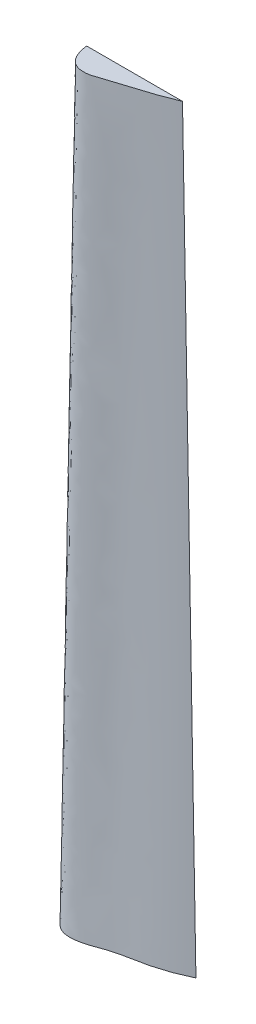
ISO-10303-21;
HEADER;
FILE_DESCRIPTION(('STEP AP214'),'2;1');
FILE_NAME('part.step','',(''),(''),'','','');
FILE_SCHEMA(('AUTOMOTIVE_DESIGN { 1 0 10303 214 1 1 1 1 }'));
ENDSEC;
DATA;
#1=APPLICATION_CONTEXT('core data for automotive mechanical design processes');
#2=APPLICATION_PROTOCOL_DEFINITION('international standard','automotive_design',2000,#1);
#3=PRODUCT_CONTEXT('',#1,'mechanical');
#4=PRODUCT('Part','Part','',(#3));
#5=PRODUCT_RELATED_PRODUCT_CATEGORY('part','',(#4));
#6=PRODUCT_DEFINITION_FORMATION('','',#4);
#7=PRODUCT_DEFINITION_CONTEXT('part definition',#1,'design');
#8=PRODUCT_DEFINITION('design','',#6,#7);
#9=PRODUCT_DEFINITION_SHAPE('','',#8);
#10=(LENGTH_UNIT() NAMED_UNIT(*) SI_UNIT(.MILLI.,.METRE.));
#11=(NAMED_UNIT(*) PLANE_ANGLE_UNIT() SI_UNIT($,.RADIAN.));
#12=(NAMED_UNIT(*) SI_UNIT($,.STERADIAN.) SOLID_ANGLE_UNIT());
#13=UNCERTAINTY_MEASURE_WITH_UNIT(LENGTH_MEASURE(1.E-05),#10,'distance_accuracy_value','');
#14=(GEOMETRIC_REPRESENTATION_CONTEXT(3) GLOBAL_UNCERTAINTY_ASSIGNED_CONTEXT((#13)) GLOBAL_UNIT_ASSIGNED_CONTEXT((#10,
#11,#12)) REPRESENTATION_CONTEXT('',''));
#15=CARTESIAN_POINT('',(0.,0.,0.));
#16=DIRECTION('',(0.,0.,1.));
#17=DIRECTION('',(1.,0.,0.));
#18=AXIS2_PLACEMENT_3D('',#15,#16,#17);
#19=CARTESIAN_POINT('',(0.,220.,0.));
#20=DIRECTION('',(0.,1.,0.));
#21=DIRECTION('',(0.,0.,1.));
#22=AXIS2_PLACEMENT_3D('',#19,#20,#21);
#23=PLANE('',#22);
#24=CARTESIAN_POINT('',(17.9356753736188,220.,0.));
#25=CARTESIAN_POINT('',(17.6745843947414,220.,0.124258185580106));
#26=CARTESIAN_POINT('',(17.4129871207745,220.,0.247471349846727));
#27=CARTESIAN_POINT('',(16.8883284609712,220.,0.491215000488047));
#28=CARTESIAN_POINT('',(16.6252661921638,220.,0.611743584182137));
#29=CARTESIAN_POINT('',(16.0974838686661,220.,0.849397931931943));
#30=CARTESIAN_POINT('',(15.8327632210935,220.,0.966522383331062));
#31=CARTESIAN_POINT('',(15.3014626985356,220.,1.19661419549458));
#32=CARTESIAN_POINT('',(15.0348825076295,220.,1.30958082835811));
#33=CARTESIAN_POINT('',(14.4997402421582,220.,1.53077405437101));
#34=CARTESIAN_POINT('',(14.2311780396367,220.,1.63900033830509));
#35=CARTESIAN_POINT('',(13.6947930858415,220.,1.84954388962534));
#36=CARTESIAN_POINT('',(13.4269890288549,220.,1.95190879503392));
#37=CARTESIAN_POINT('',(12.8896417448132,220.,2.15186733967646));
#38=CARTESIAN_POINT('',(12.6200987280809,220.,2.24946154410745));
#39=CARTESIAN_POINT('',(12.0793505091102,220.,2.439803263402));
#40=CARTESIAN_POINT('',(11.8081455543879,220.,2.53255148128734));
#41=CARTESIAN_POINT('',(11.2641293030185,220.,2.71306606708702));
#42=CARTESIAN_POINT('',(10.9913182698034,220.,2.80083322818558));
#43=CARTESIAN_POINT('',(10.4441105699269,220.,2.97113730157665));
#44=CARTESIAN_POINT('',(10.1697141331291,220.,3.05367495229908));
#45=CARTESIAN_POINT('',(9.54915223631109,220.,3.23375440322171));
#46=CARTESIAN_POINT('',(9.20253733056889,220.,3.32975166423543));
#47=CARTESIAN_POINT('',(8.50708583236111,220.,3.51346171073488));
#48=CARTESIAN_POINT('',(8.15824900427751,220.,3.60117360146547));
#49=CARTESIAN_POINT('',(7.45875033282788,220.,3.76920610694126));
#50=CARTESIAN_POINT('',(7.10808821546304,220.,3.84952557608203));
#51=CARTESIAN_POINT('',(6.40541884334964,220.,4.00400123260278));
#52=CARTESIAN_POINT('',(6.05341158520402,220.,4.07815740440704));
#53=CARTESIAN_POINT('',(5.34883336884934,220.,4.22239726981944));
#54=CARTESIAN_POINT('',(4.99626299021932,220.,4.2924838246069));
#55=CARTESIAN_POINT('',(4.29074670369543,220.,4.43047062291408));
#56=CARTESIAN_POINT('',(3.93780085137768,220.,4.49837115317218));
#57=CARTESIAN_POINT('',(3.40837967949286,220.,4.60016618341384));
#58=CARTESIAN_POINT('',(3.23190954639736,220.,4.63408779968064));
#59=CARTESIAN_POINT('',(2.87903393025213,220.,4.70226506728379));
#60=CARTESIAN_POINT('',(2.70262844739229,220.,4.73652071959319));
#61=CARTESIAN_POINT('',(2.17361988955152,220.,4.84048198116401));
#62=CARTESIAN_POINT('',(1.82124418456845,220.,4.91137824861031));
#63=CARTESIAN_POINT('',(1.29423383065323,220.,5.02267758985397));
#64=CARTESIAN_POINT('',(1.11906650402693,220.,5.06054678051437));
#65=CARTESIAN_POINT('',(0.769189700266165,220.,5.13835946490068));
#66=CARTESIAN_POINT('',(0.59448022925804,220.,5.17830298623486));
#67=CARTESIAN_POINT('',(0.245579648827286,220.,5.26034850178093));
#68=CARTESIAN_POINT('',(0.0713885095947851,220.,5.30245036922217));
#69=CARTESIAN_POINT('',(-0.276377929542773,220.,5.38908540452656));
#70=CARTESIAN_POINT('',(-0.449953275587467,220.,5.43361838595298));
#71=CARTESIAN_POINT('',(-0.710239606834221,220.,5.50290480090183));
#72=CARTESIAN_POINT('',(-0.797261024324483,220.,5.52649248627727));
#73=CARTESIAN_POINT('',(-0.971058848225949,220.,5.57455363384174));
#74=CARTESIAN_POINT('',(-1.05783525468675,220.,5.59902709585144));
#75=CARTESIAN_POINT('',(-1.31778253975794,220.,5.67377990997176));
#76=CARTESIAN_POINT('',(-1.49057219973852,220.,5.72539188019096));
#77=CARTESIAN_POINT('',(-1.83507092039475,220.,5.8320398875767));
#78=CARTESIAN_POINT('',(-2.00678007871897,220.,5.88707561028765));
#79=CARTESIAN_POINT('',(-2.34912014719449,220.,6.00026313280188));
#80=CARTESIAN_POINT('',(-2.51975131692072,220.,6.05841414778679));
#81=CARTESIAN_POINT('',(-2.92000003637014,220.,6.19853250248257));
#82=CARTESIAN_POINT('',(-3.14920556750189,220.,6.28166870505999));
#83=CARTESIAN_POINT('',(-3.60703584978255,220.,6.44954062992792));
#84=CARTESIAN_POINT('',(-3.8356605581591,220.,6.53427646635271));
#85=CARTESIAN_POINT('',(-4.17906181714093,220.,6.66017686500914));
#86=CARTESIAN_POINT('',(-4.2936144041778,220.,6.70194602270268));
#87=CARTESIAN_POINT('',(-4.52298691525059,220.,6.78474187233336));
#88=CARTESIAN_POINT('',(-4.63780683782775,220.,6.82576856831118));
#89=CARTESIAN_POINT('',(-4.98279093361294,220.,6.94735471042534));
#90=CARTESIAN_POINT('',(-5.21348456772825,220.,7.02642212028772));
#91=CARTESIAN_POINT('',(-5.56091928610701,220.,7.14201403112369));
#92=CARTESIAN_POINT('',(-5.67714356026004,220.,7.18009953490928));
#93=CARTESIAN_POINT('',(-5.9099583229908,220.,7.25513383828361));
#94=CARTESIAN_POINT('',(-6.02654881097034,220.,7.292082639728));
#95=CARTESIAN_POINT('',(-6.37697342347263,220.,7.40084732382348));
#96=CARTESIAN_POINT('',(-6.61146137715159,220.,7.47058171535971));
#97=CARTESIAN_POINT('',(-7.07824984969774,220.,7.60158797938875));
#98=CARTESIAN_POINT('',(-7.31051355717142,220.,7.66298978387524));
#99=CARTESIAN_POINT('',(-7.66041557721527,220.,7.74895043117744));
#100=CARTESIAN_POINT('',(-7.77730287956583,220.,7.77658076699452));
#101=CARTESIAN_POINT('',(-8.01158034535783,220.,7.82961712936871));
#102=CARTESIAN_POINT('',(-8.1289705092009,220.,7.85502315414894));
#103=CARTESIAN_POINT('',(-8.48152302189106,220.,7.92744116610383));
#104=CARTESIAN_POINT('',(-8.7174661320411,220.,7.97075266489475));
#105=CARTESIAN_POINT('',(-9.19131331770284,220.,8.0452395096841));
#106=CARTESIAN_POINT('',(-9.42921757515879,220.,8.07641371641311));
#107=CARTESIAN_POINT('',(-9.90543968448188,220.,8.12432081291977));
#108=CARTESIAN_POINT('',(-10.143750849884,220.,8.14111810017481));
#109=CARTESIAN_POINT('',(-10.6209156871192,220.,8.15812493542641));
#110=CARTESIAN_POINT('',(-10.8597690897629,220.,8.15834143165338));
#111=CARTESIAN_POINT('',(-11.3191093460747,220.,8.14037867486133));
#112=CARTESIAN_POINT('',(-11.5396434120626,220.,8.12356377995662));
#113=CARTESIAN_POINT('',(-11.8687802990093,220.,8.08448490414536));
#114=CARTESIAN_POINT('',(-11.9782255050494,220.,8.06914708246528));
#115=CARTESIAN_POINT('',(-12.1963760255786,220.,8.03357712619998));
#116=CARTESIAN_POINT('',(-12.3050809156567,220.,8.01334239324527));
#117=CARTESIAN_POINT('',(-12.6295108576939,220.,7.94493313478044));
#118=CARTESIAN_POINT('',(-12.8436781348994,220.,7.8890391504018));
#119=CARTESIAN_POINT('',(-13.2649535021318,220.,7.7552148870856));
#120=CARTESIAN_POINT('',(-13.472065444909,220.,7.67729685832708));
#121=CARTESIAN_POINT('',(-13.8213986570227,220.,7.52293763716322));
#122=CARTESIAN_POINT('',(-13.9659863264342,220.,7.45182587998018));
#123=CARTESIAN_POINT('',(-14.2484574770991,220.,7.29736241246307));
#124=CARTESIAN_POINT('',(-14.3863425784512,220.,7.21401367974613));
#125=CARTESIAN_POINT('',(-14.6540638974358,220.,7.03557993325182));
#126=CARTESIAN_POINT('',(-14.7839090340396,220.,6.9405082875888));
#127=CARTESIAN_POINT('',(-15.0348130462058,220.,6.73937452706912));
#128=CARTESIAN_POINT('',(-15.1558714735178,220.,6.63331185217855));
#129=CARTESIAN_POINT('',(-15.3300758952929,220.,6.46723516079898));
#130=CARTESIAN_POINT('',(-15.3867618884535,220.,6.41088344114673));
#131=CARTESIAN_POINT('',(-15.4977945330678,220.,6.29591961543113));
#132=CARTESIAN_POINT('',(-15.5521411862926,220.,6.23730751107919));
#133=CARTESIAN_POINT('',(-15.7117161858106,220.,6.05839981070726));
#134=CARTESIAN_POINT('',(-15.8135001683831,220.,5.9350130407964));
#135=CARTESIAN_POINT('',(-16.0084950869388,220.,5.68133070679519));
#136=CARTESIAN_POINT('',(-16.1016894956868,220.,5.55102255417763));
#137=CARTESIAN_POINT('',(-16.2798476404402,220.,5.28487862902487));
#138=CARTESIAN_POINT('',(-16.3648098629052,220.,5.1490418465102));
#139=CARTESIAN_POINT('',(-16.5182700574874,220.,4.88772666410068));
#140=CARTESIAN_POINT('',(-16.5875557573159,220.,4.76270797381678));
#141=CARTESIAN_POINT('',(-16.7203446068483,220.,4.5096154168663));
#142=CARTESIAN_POINT('',(-16.7838467587747,220.,4.38154102782221));
#143=CARTESIAN_POINT('',(-16.9054188108167,220.,4.1227813693117));
#144=CARTESIAN_POINT('',(-16.9634863724906,220.,3.9920950050266));
#145=CARTESIAN_POINT('',(-17.0744549772327,220.,3.72855970096117));
#146=CARTESIAN_POINT('',(-17.1273563841324,220.,3.5957109142414));
#147=CARTESIAN_POINT('',(-17.2279070848205,220.,3.32771616254029));
#148=CARTESIAN_POINT('',(-17.2755450157788,220.,3.1925659275963));
#149=CARTESIAN_POINT('',(-17.3654818384549,220.,2.92050894000299));
#150=CARTESIAN_POINT('',(-17.4077806613511,220.,2.78360216473677));
#151=CARTESIAN_POINT('',(-17.5269266316805,220.,2.3707724001028));
#152=CARTESIAN_POINT('',(-17.5960771475213,220.,2.09259491974642));
#153=CARTESIAN_POINT('',(-17.688574760292,220.,1.66261311742592));
#154=CARTESIAN_POINT('',(-17.7182800388327,220.,1.51211072586057));
#155=CARTESIAN_POINT('',(-17.7730824891498,220.,1.21027214946972));
#156=CARTESIAN_POINT('',(-17.7981799620675,220.,1.05893601979913));
#157=CARTESIAN_POINT('',(-17.8440932630723,220.,0.756576461433774));
#158=CARTESIAN_POINT('',(-17.8649344703319,220.,0.605556832098879));
#159=CARTESIAN_POINT('',(-17.9029486872014,220.,0.303076863943516));
#160=CARTESIAN_POINT('',(-17.9201222235085,220.,0.151616591572501));
#161=CARTESIAN_POINT('',(-17.9356753736188,220.,0.));
#162=B_SPLINE_CURVE_WITH_KNOTS('',3,(#24,#25,#26,#27,#28,#29,#30,#31,#32,#33,#34,#35,#36,#37,
#38,#39,#40,#41,#42,#43,#44,#45,#46,#47,#48,#49,#50,#51,#52,#53,#54,#55,#56,#57,#58,#59,#60,#61,
#62,#63,#64,#65,#66,#67,#68,#69,#70,#71,#72,#73,#74,#75,#76,#77,#78,#79,#80,#81,#82,#83,#84,#85,
#86,#87,#88,#89,#90,#91,#92,#93,#94,#95,#96,#97,#98,#99,#100,#101,#102,#103,#104,#105,#106,#107,
#108,#109,#110,#111,#112,#113,#114,#115,#116,#117,#118,#119,#120,#121,#122,#123,#124,#125,#126,
#127,#128,#129,#130,#131,#132,#133,#134,#135,#136,#137,#138,#139,#140,#141,#142,#143,#144,#145,
#146,#147,#148,#149,#150,#151,#152,#153,#154,#155,#156,#157,#158,#159,#160,#161),.UNSPECIFIED.,
.F.,.F.,(4,2,2,2,2,2,2,2,2,2,2,2,2,2,2,2,2,2,2,2,2,2,2,2,2,2,2,2,2,2,2,2,2,2,2,2,2,2,2,2,2,2,2,
2,2,2,2,2,2,2,2,2,2,2,2,2,2,2,2,2,2,2,2,2,2,2,2,2,4),(0.,0.86746442077449,1.73552525438743,
2.60391649284673,3.47245904259709,4.341058163683,5.20111661758335,6.06107292999978,
6.92090413759492,7.78059803913286,8.64017027631175,9.71904719045889,10.7980404819859,
11.8772007046712,12.9563636545006,14.0347584666867,15.1130112459106,15.6521132594036,
16.1912168437847,17.2694834654726,17.8071149089996,18.3447535099589,18.8823605687665,
19.4199264574395,19.6904069478738,19.9608873835509,20.5018460338968,21.0427550728749,
21.5835284786285,22.3149485715641,23.0464210502415,23.4122091390702,23.7779952365849,
24.5095510039364,24.8764623517259,25.2433731005063,25.9771924441607,26.6977782990811,
27.0580848205952,27.4183916299364,28.1377731688214,28.8572222163315,29.5734315671591,
30.2893407866583,30.9521067173831,31.2835524244223,31.6151743882829,32.2780365016823,
32.9405306420558,33.4233705709815,33.9060932048369,34.388270374716,34.8704721254107,
35.1102062362009,35.349940165483,35.8293225858632,36.3096089301083,36.7899834111925,
37.2186292577126,37.6473489146697,38.0762522047141,38.5051252670156,38.9349068032918,
39.3646938789218,40.2238050401421,40.6839721701513,41.1441092154149,41.6014168456886,
42.0586587599192),.UNSPECIFIED.);
#163=CARTESIAN_POINT('',(17.9356753736188,220.,0.));
#164=VERTEX_POINT('',#163);
#165=CARTESIAN_POINT('',(-17.9356753736188,220.,0.));
#166=VERTEX_POINT('',#165);
#167=EDGE_CURVE('E55',#164,#166,#162,.T.);
#168=ORIENTED_EDGE('',*,*,#167,.T.);
#169=DIRECTION('',(-1.,0.,0.));
#170=VECTOR('',#169,1.);
#171=CARTESIAN_POINT('',(0.,220.,0.));
#172=LINE('',#171,#170);
#173=EDGE_CURVE('E43',#164,#166,#172,.T.);
#174=ORIENTED_EDGE('',*,*,#173,.F.);
#175=EDGE_LOOP('',(#168,#174));
#176=FACE_BOUND('',#175,.T.);
#177=ADVANCED_FACE('F36',(#176),#23,.F.);
#178=CARTESIAN_POINT('',(0.,0.,0.));
#179=DIRECTION('',(0.,0.,1.));
#180=DIRECTION('',(1.,0.,0.));
#181=AXIS2_PLACEMENT_3D('',#178,#179,#180);
#182=PLANE('',#181);
#183=CARTESIAN_POINT('',(-20.,0.,0.));
#184=CARTESIAN_POINT('',(-20.256349581953,16.670610506389,0.));
#185=CARTESIAN_POINT('',(-18.7367195156739,232.38324777362,0.));
#186=CARTESIAN_POINT('',(-13.5896829152863,450.003943839722,0.));
#187=CARTESIAN_POINT('',(-10.,650.,0.));
#188=B_SPLINE_CURVE_WITH_KNOTS('',3,(#183,#184,#185,#186,#187),.UNSPECIFIED.,.F.,.F.,(4,1,4),
(0.,0.0772277647000197,1.),.UNSPECIFIED.);
#189=CARTESIAN_POINT('',(-14.0095378187573,440.,0.));
#190=VERTEX_POINT('',#189);
#191=EDGE_CURVE('E48',#190,#166,#188,.F.);
#192=ORIENTED_EDGE('',*,*,#191,.F.);
#193=DIRECTION('',(-1.,0.,0.));
#194=VECTOR('',#193,1.);
#195=CARTESIAN_POINT('',(0.,440.,0.));
#196=LINE('',#195,#194);
#197=CARTESIAN_POINT('',(14.0095378187573,440.,0.));
#198=VERTEX_POINT('',#197);
#199=EDGE_CURVE('E11',#198,#190,#196,.T.);
#200=ORIENTED_EDGE('',*,*,#199,.F.);
#201=CARTESIAN_POINT('',(20.,0.,0.));
#202=CARTESIAN_POINT('',(20.256349581953,16.670610506389,0.));
#203=CARTESIAN_POINT('',(18.7367195156739,232.38324777362,0.));
#204=CARTESIAN_POINT('',(13.5896829152863,450.003943839722,0.));
#205=CARTESIAN_POINT('',(10.,650.,0.));
#206=B_SPLINE_CURVE_WITH_KNOTS('',3,(#201,#202,#203,#204,#205),.UNSPECIFIED.,.F.,.F.,(4,1,4),
(0.,0.0772277647000197,1.),.UNSPECIFIED.);
#207=EDGE_CURVE('E74',#164,#198,#206,.T.);
#208=ORIENTED_EDGE('',*,*,#207,.F.);
#209=ORIENTED_EDGE('',*,*,#173,.T.);
#210=EDGE_LOOP('',(#192,#200,#208,#209));
#211=FACE_BOUND('',#210,.T.);
#212=ADVANCED_FACE('F73',(#211),#182,.F.);
#213=CARTESIAN_POINT('',(0.,440.,0.));
#214=DIRECTION('',(0.,1.,0.));
#215=DIRECTION('',(0.,0.,1.));
#216=AXIS2_PLACEMENT_3D('',#213,#214,#215);
#217=PLANE('',#216);
#218=CARTESIAN_POINT('',(14.0095378188736,439.999999997,0.));
#219=CARTESIAN_POINT('',(13.7508450401478,439.999999998924,0.112383346640443));
#220=CARTESIAN_POINT('',(13.4918771586435,439.999999999712,0.224151463181848));
#221=CARTESIAN_POINT('',(12.973008606597,440.000000000288,0.44558350917625));
#222=CARTESIAN_POINT('',(12.7131078295039,440.000000000075,0.555247188564404));
#223=CARTESIAN_POINT('',(12.1920554194814,439.999999999925,0.771568183245501));
#224=CARTESIAN_POINT('',(11.9309038037866,439.999999999986,0.878225539822055));
#225=CARTESIAN_POINT('',(11.5379798153726,440.000000000007,1.03520878999496));
#226=CARTESIAN_POINT('',(11.4068067959291,440.000000000002,1.08703566696665));
#227=CARTESIAN_POINT('',(11.1440291048554,439.999999999998,1.18958314782955));
#228=CARTESIAN_POINT('',(11.0124244332715,439.999999999999,1.24030375183937));
#229=CARTESIAN_POINT('',(10.6180369699165,440.000000000001,1.39044567610772));
#230=CARTESIAN_POINT('',(10.3546416485487,440.,1.48826229076998));
#231=CARTESIAN_POINT('',(9.82640172067263,440.,1.67986256338509));
#232=CARTESIAN_POINT('',(9.561557162288,440.,1.77364635434733));
#233=CARTESIAN_POINT('',(9.03061797313309,440.,1.9575679888297));
#234=CARTESIAN_POINT('',(8.76452339077109,440.,2.04770597225879));
#235=CARTESIAN_POINT('',(8.23123336093688,440.,2.22457706992165));
#236=CARTESIAN_POINT('',(7.96403801834967,440.,2.31131050062677));
#237=CARTESIAN_POINT('',(7.42839995090549,440.,2.48158194046256));
#238=CARTESIAN_POINT('',(7.15995640780903,440.,2.56511737283973));
#239=CARTESIAN_POINT('',(6.62220443061508,440.,2.72936924076041));
#240=CARTESIAN_POINT('',(6.35289597785539,440.,2.81008561502457));
#241=CARTESIAN_POINT('',(5.81365805194419,440.,2.96953309256221));
#242=CARTESIAN_POINT('',(5.54372850522159,440.,3.0482639458668));
#243=CARTESIAN_POINT('',(5.13863203363628,440.,3.16573647686721));
#244=CARTESIAN_POINT('',(5.00355585572278,440.,3.2047929894846));
#245=CARTESIAN_POINT('',(4.7333928803061,440.,3.28286926310475));
#246=CARTESIAN_POINT('',(4.59830608280571,440.,3.32188902411713));
#247=CARTESIAN_POINT('',(4.19316745921284,440.,3.43899336483345));
#248=CARTESIAN_POINT('',(3.92313692607612,440.,3.5171519649854));
#249=CARTESIAN_POINT('',(3.38337302475596,440.,3.67441364833837));
#250=CARTESIAN_POINT('',(3.1136396351676,440.,3.75351665788559));
#251=CARTESIAN_POINT('',(2.57481516544749,440.,3.91363782576127));
#252=CARTESIAN_POINT('',(2.30572393447936,440.,3.9946554727188));
#253=CARTESIAN_POINT('',(1.90287338307192,440.,4.11857362991864));
#254=CARTESIAN_POINT('',(1.76874432486213,440.,4.16027078875171));
#255=CARTESIAN_POINT('',(1.50079123553123,440.,4.24463393928769));
#256=CARTESIAN_POINT('',(1.36696720350506,440.,4.28729992811178));
#257=CARTESIAN_POINT('',(1.10263635606894,440.,4.37272399347734));
#258=CARTESIAN_POINT('',(0.972122037680851,440.,4.41545885813627));
#259=CARTESIAN_POINT('',(0.711398881689612,440.,4.50185348742107));
#260=CARTESIAN_POINT('',(0.581190046628231,440.,4.54551325971252));
#261=CARTESIAN_POINT('',(0.321085557558604,440.,4.63381760505562));
#262=CARTESIAN_POINT('',(0.191189950387413,440.,4.67846231634585));
#263=CARTESIAN_POINT('',(-0.068140194140423,440.,4.76906893687903));
#264=CARTESIAN_POINT('',(-0.197574738272755,440.,4.81503082667446));
#265=CARTESIAN_POINT('',(-0.455965273816637,440.,4.90846571556516));
#266=CARTESIAN_POINT('',(-0.58492101403061,440.,4.95593940906357));
#267=CARTESIAN_POINT('',(-0.842363561821013,440.,5.05214328168318));
#268=CARTESIAN_POINT('',(-0.970850364088309,440.,5.10087347497991));
#269=CARTESIAN_POINT('',(-1.22752560266736,440.,5.19940584678057));
#270=CARTESIAN_POINT('',(-1.35571373176325,440.,5.24920882441906));
#271=CARTESIAN_POINT('',(-1.61176980429934,440.,5.3496282667723));
#272=CARTESIAN_POINT('',(-1.73963774875145,440.,5.40024472891234));
#273=CARTESIAN_POINT('',(-1.99509383377688,440.,5.50187618670441));
#274=CARTESIAN_POINT('',(-2.12268211743358,440.,5.55289082409047));
#275=CARTESIAN_POINT('',(-2.3779994774495,440.,5.65457055185006));
#276=CARTESIAN_POINT('',(-2.50572855475452,440.,5.70523563985866));
#277=CARTESIAN_POINT('',(-2.76150661205147,440.,5.80552634764648));
#278=CARTESIAN_POINT('',(-2.88955534989572,440.,5.85515258157792));
#279=CARTESIAN_POINT('',(-3.14627369400934,440.,5.95276964548993));
#280=CARTESIAN_POINT('',(-3.27494328726586,440.,6.00076050957859));
#281=CARTESIAN_POINT('',(-3.66185617020619,440.,6.14143180452453));
#282=CARTESIAN_POINT('',(-3.92126876191732,440.,6.2309174194604));
#283=CARTESIAN_POINT('',(-4.44303550159435,440.,6.40054957744938));
#284=CARTESIAN_POINT('',(-4.70538826565743,440.,6.48070032732943));
#285=CARTESIAN_POINT('',(-5.15982744562429,440.,6.60734246481));
#286=CARTESIAN_POINT('',(-5.35103179430173,440.,6.65697638385365));
#287=CARTESIAN_POINT('',(-5.73541361421217,440.,6.74837816876288));
#288=CARTESIAN_POINT('',(-5.92859190287572,440.,6.79014262405928));
#289=CARTESIAN_POINT('',(-6.31695647802769,440.,6.86449527367451));
#290=CARTESIAN_POINT('',(-6.51214476230114,440.,6.89707319023113));
#291=CARTESIAN_POINT('',(-6.90406423681471,440.,6.95098996913304));
#292=CARTESIAN_POINT('',(-7.10079510940429,440.,6.97233108672382));
#293=CARTESIAN_POINT('',(-7.49797684270234,440.,7.00206417489809));
#294=CARTESIAN_POINT('',(-7.69844183122792,440.,7.01027545730844));
#295=CARTESIAN_POINT('',(-8.09950617923262,440.,7.01109047846873));
#296=CARTESIAN_POINT('',(-8.30010555908387,440.,7.00369060039197));
#297=CARTESIAN_POINT('',(-8.69945863578217,440.,6.97123109752723));
#298=CARTESIAN_POINT('',(-8.89821553813062,440.,6.94621254556011));
#299=CARTESIAN_POINT('',(-9.29221979318465,440.,6.87643064970647));
#300=CARTESIAN_POINT('',(-9.48746931183561,440.,6.83167996029525));
#301=CARTESIAN_POINT('',(-9.81219443194836,440.,6.73786998641982));
#302=CARTESIAN_POINT('',(-9.94330869154232,440.,6.69443981719865));
#303=CARTESIAN_POINT('',(-10.2015638249541,440.,6.59702809651949));
#304=CARTESIAN_POINT('',(-10.3287052199174,440.,6.54304793576618));
#305=CARTESIAN_POINT('',(-10.5778220658608,440.,6.42459198071565));
#306=CARTESIAN_POINT('',(-10.699803561384,440.,6.36012892120605));
#307=CARTESIAN_POINT('',(-10.9377054814521,440.,6.2208365514673));
#308=CARTESIAN_POINT('',(-11.0536258968158,440.,6.14600722553599));
#309=CARTESIAN_POINT('',(-11.2784972043633,440.,5.98652900680848));
#310=CARTESIAN_POINT('',(-11.3874481088893,440.,5.9018801314024));
#311=CARTESIAN_POINT('',(-11.5977474961513,440.,5.72363568677599));
#312=CARTESIAN_POINT('',(-11.6990960726261,440.,5.630040227902));
#313=CARTESIAN_POINT('',(-11.8939705766703,440.,5.43485618887387));
#314=CARTESIAN_POINT('',(-11.9874881631682,440.,5.33325930404136));
#315=CARTESIAN_POINT('',(-12.1665875662559,440.,5.12331095684617));
#316=CARTESIAN_POINT('',(-12.2521682025078,440.,5.01495849382654));
#317=CARTESIAN_POINT('',(-12.4563102340898,440.,4.73755797692421));
#318=CARTESIAN_POINT('',(-12.5701845678844,440.,4.56505352029513));
#319=CARTESIAN_POINT('',(-12.7823450357677,440.,4.21069369868597));
#320=CARTESIAN_POINT('',(-12.8806215965401,440.,4.02883268097261));
#321=CARTESIAN_POINT('',(-13.0634612773384,440.,3.65723727869014));
#322=CARTESIAN_POINT('',(-13.1479515616317,440.,3.46746733081));
#323=CARTESIAN_POINT('',(-13.3040225105548,440.,3.08280073228563));
#324=CARTESIAN_POINT('',(-13.3756071735492,440.,2.88790569099256));
#325=CARTESIAN_POINT('',(-13.5141722318846,440.,2.47140285404107));
#326=CARTESIAN_POINT('',(-13.5796722040146,440.,2.24930421642812));
#327=CARTESIAN_POINT('',(-13.6972668434548,440.,1.80152295396813));
#328=CARTESIAN_POINT('',(-13.7493549280787,440.,1.57583862670304));
#329=CARTESIAN_POINT('',(-13.8413257718514,440.,1.12574163798313));
#330=CARTESIAN_POINT('',(-13.8813885077961,440.,0.901365299517266));
#331=CARTESIAN_POINT('',(-13.9344374968011,440.,0.563871872600625));
#332=CARTESIAN_POINT('',(-13.9509382332997,440.,0.451289524719057));
#333=CARTESIAN_POINT('',(-13.9817963668518,440.,0.225843462512521));
#334=CARTESIAN_POINT('',(-13.9961539996982,440.,0.11297978053232));
#335=CARTESIAN_POINT('',(-14.0095378187573,440.,0.));
#336=B_SPLINE_CURVE_WITH_KNOTS('',3,(#218,#219,#220,#221,#222,#223,#224,#225,#226,#227,#228,
#229,#230,#231,#232,#233,#234,#235,#236,#237,#238,#239,#240,#241,#242,#243,#244,#245,#246,#247,
#248,#249,#250,#251,#252,#253,#254,#255,#256,#257,#258,#259,#260,#261,#262,#263,#264,#265,#266,
#267,#268,#269,#270,#271,#272,#273,#274,#275,#276,#277,#278,#279,#280,#281,#282,#283,#284,#285,
#286,#287,#288,#289,#290,#291,#292,#293,#294,#295,#296,#297,#298,#299,#300,#301,#302,#303,#304,
#305,#306,#307,#308,#309,#310,#311,#312,#313,#314,#315,#316,#317,#318,#319,#320,#321,#322,#323,
#324,#325,#326,#327,#328,#329,#330,#331,#332,#333,#334,#335),.UNSPECIFIED.,.F.,.F.,(4,2,2,2,2,2,
2,2,2,2,2,2,2,2,2,2,2,2,2,2,2,2,2,2,2,2,2,2,2,2,2,2,2,2,2,2,2,2,2,2,2,2,2,2,2,2,2,2,2,2,2,2,2,2,
2,2,2,2,4),(0.,0.84615872440765,1.69241738073684,2.53866441035386,2.96178104830071,
3.38489764087874,4.22777437394376,5.07062328614476,5.91343982301991,6.75617782916974,
7.5995811532875,8.44300279951043,9.28653010424642,9.70835822472348,10.1301862348633,
10.9735285539721,11.8168055255814,12.6598597606856,13.0812393838676,13.5026177551101,
13.914611867563,14.3266093959397,14.7386651217481,15.1507147668796,15.5629564852674,
15.9752028565079,16.3877677319297,16.8003313018284,17.212558769281,17.624789022995,
18.0367682677898,18.448738914877,19.2718232993771,20.0945353075707,20.6870148007776,
21.2797504826966,21.8731467009607,22.4664237781099,23.0677971576376,23.6693098799234,
24.2694249721008,24.8691557611892,25.2831027094634,25.6969951278219,26.1103884486815,
26.5237823957302,26.9371756106822,27.3505637275383,27.7643867020363,28.1782711195612,
28.7973729274496,29.4168532590468,30.0395072933657,30.6619680869034,31.3561366191059,
32.0506452093845,32.7341716234518,33.0755106696901,33.4168121327184),.UNSPECIFIED.);
#337=EDGE_CURVE('E70',#198,#190,#336,.T.);
#338=ORIENTED_EDGE('',*,*,#337,.F.);
#339=ORIENTED_EDGE('',*,*,#199,.T.);
#340=EDGE_LOOP('',(#338,#339));
#341=FACE_BOUND('',#340,.T.);
#342=ADVANCED_FACE('F68',(#341),#217,.T.);
#343=CARTESIAN_POINT('',(-20.,0.,0.));
#344=CARTESIAN_POINT('',(-20.256349581953,16.670610506389,0.));
#345=CARTESIAN_POINT('',(-18.7367195156739,232.38324777362,0.));
#346=CARTESIAN_POINT('',(-13.5896829152863,450.003943839722,0.));
#347=CARTESIAN_POINT('',(-10.,650.,0.));
#348=CARTESIAN_POINT('',(-20.,0.,1.37978752480775));
#349=CARTESIAN_POINT('',(-20.1935677058434,16.6702338352627,1.4431794589138));
#350=CARTESIAN_POINT('',(-18.4750279193514,232.385513902819,2.10063768070799));
#351=CARTESIAN_POINT('',(-13.4447774263933,450.003567168596,1.16069818393365));
#352=CARTESIAN_POINT('',(-9.89828887182295,650.,0.932734768905875));
#353=CARTESIAN_POINT('',(-19.7200384574839,0.,4.07438601133875));
#354=CARTESIAN_POINT('',(-19.788042411108,16.6694804930099,4.26456181365689));
#355=CARTESIAN_POINT('',(-17.5483205331398,232.390046161216,4.31607831282829));
#356=CARTESIAN_POINT('',(-13.0237833475682,450.002813826343,3.25547695831171));
#357=CARTESIAN_POINT('',(-9.56368351442973,650.,2.57158671322838));
#358=CARTESIAN_POINT('',(-18.5402036468492,0.,7.84130849244644));
#359=CARTESIAN_POINT('',(-18.4169756557895,16.6676407807078,7.67299343423614));
#360=CARTESIAN_POINT('',(-15.6177264272556,232.401114240166,6.32276997454582));
#361=CARTESIAN_POINT('',(-11.8773308201719,450.000974114041,5.39518764541589));
#362=CARTESIAN_POINT('',(-8.73340717403114,650.,4.42169812718769));
#363=CARTESIAN_POINT('',(-16.6824708502785,0.,11.251333533352));
#364=CARTESIAN_POINT('',(-16.4330290665787,16.6642371594434,10.4918143225703));
#365=CARTESIAN_POINT('',(-13.3681472713315,232.421591109744,6.4744116662308));
#366=CARTESIAN_POINT('',(-10.4051553682741,449.997570492776,6.81395901590874));
#367=CARTESIAN_POINT('',(-7.63994352813238,650.,5.73532931656585));
#368=CARTESIAN_POINT('',(-14.2246503399282,0.,14.2263852406511));
#369=CARTESIAN_POINT('',(-13.9454056372286,16.6588170255164,12.7071950898183));
#370=CARTESIAN_POINT('',(-11.059465191726,232.454199724775,5.53270309961104));
#371=CARTESIAN_POINT('',(-8.69449024887246,449.99215035885,7.61252482945238));
#372=CARTESIAN_POINT('',(-6.34847357554203,650.,6.58416655930618));
#373=CARTESIAN_POINT('',(-11.7488904012315,0.,16.2716166742531));
#374=CARTESIAN_POINT('',(-11.550711262461,16.6528358552679,14.0883831212828));
#375=CARTESIAN_POINT('',(-9.26005873568501,232.49018364707,4.17466996746817));
#376=CARTESIAN_POINT('',(-7.15917447522364,449.986169188601,7.88324849588856));
#377=CARTESIAN_POINT('',(-5.16156085848092,650.,6.96394120434432));
#378=CARTESIAN_POINT('',(-9.54540373090259,0.,17.6116317734678));
#379=CARTESIAN_POINT('',(-9.48689676979931,16.6475301370302,14.9224284769073));
#380=CARTESIAN_POINT('',(-7.97863318616421,232.522103914319,2.94153504606283));
#381=CARTESIAN_POINT('',(-5.9013015953239,449.980863470363,7.91353672182096));
#382=CARTESIAN_POINT('',(-4.16701555697012,650.,7.09828915626905));
#383=CARTESIAN_POINT('',(-7.79812645725006,0.,18.4553750293584));
#384=CARTESIAN_POINT('',(-7.87931053097464,16.6434398395307,15.4137955035977));
#385=CARTESIAN_POINT('',(-7.09923291213167,232.546711966134,1.99694304574566));
#386=CARTESIAN_POINT('',(-4.94985930952311,449.976773172865,7.85760109898393));
#387=CARTESIAN_POINT('',(-3.40394839842598,650.,7.12108475572009));
#388=CARTESIAN_POINT('',(-5.95516553039739,0.,19.1301710755895));
#389=CARTESIAN_POINT('',(-6.2198807832645,16.6393987053937,15.7738582997024));
#390=CARTESIAN_POINT('',(-6.34226633688151,232.571024241278,1.07688333064498));
#391=CARTESIAN_POINT('',(-4.00248517645572,449.972732038727,7.73553482050855));
#392=CARTESIAN_POINT('',(-2.62907243899069,650.000000000001,7.07268550823897));
#393=CARTESIAN_POINT('',(-3.40846925754294,0.,19.7899197891073));
#394=CARTESIAN_POINT('',(-3.95958531006944,16.6342594226209,16.0782413206102));
#395=CARTESIAN_POINT('',(-5.45129732888407,232.60194319932,-0.0628497071162823));
#396=CARTESIAN_POINT('',(-2.74546720834496,449.967592755954,7.49979737785407));
#397=CARTESIAN_POINT('',(-1.58729193391529,650.000000000001,6.92225407243513));
#398=CARTESIAN_POINT('',(0.000338813714066081,0.,20.1407399847552));
#399=CARTESIAN_POINT('',(-1.03842456539359,16.6286551898342,16.1293558099061));
#400=CARTESIAN_POINT('',(-4.75099123044807,232.63565939009,-1.22998203042801));
#401=CARTESIAN_POINT('',(-1.22684461627406,449.961988523168,7.09558267507744));
#402=CARTESIAN_POINT('',(-0.282291207942671,650.000000000001,6.59008024815184));
#403=CARTESIAN_POINT('',(3.40780903607399,0.,19.789985180593));
#404=CARTESIAN_POINT('',(1.86354567694702,16.6251516691759,15.7393942119043));
#405=CARTESIAN_POINT('',(-4.14031275880615,232.6567372745,-1.78944259670851));
#406=CARTESIAN_POINT('',(0.252171276742997,449.95848500251,6.61998004436285));
#407=CARTESIAN_POINT('',(0.990747100735126,650.000000000001,6.1108638348997));
#408=CARTESIAN_POINT('',(5.95528162059442,0.,19.1301806922869));
#409=CARTESIAN_POINT('',(4.09625472034237,16.62404146305,15.1829277311695));
#410=CARTESIAN_POINT('',(-3.38930850546504,232.66341649768,-1.93346799301478));
#411=CARTESIAN_POINT('',(1.44795080466765,449.957374796384,6.20132510416273));
#412=CARTESIAN_POINT('',(1.98282633920866,650.000000000001,5.65777692853481));
#413=CARTESIAN_POINT('',(7.79808201365186,0.,18.4553674377235));
#414=CARTESIAN_POINT('',(5.73065985480273,16.6240141774205,14.6480888468884));
#415=CARTESIAN_POINT('',(-2.75618144238895,232.663580653511,-1.90333303640423));
#416=CARTESIAN_POINT('',(2.33988440541395,449.957347510754,5.86966621221923));
#417=CARTESIAN_POINT('',(2.71191657430651,650.000000000001,5.28773280528408));
#418=CARTESIAN_POINT('',(9.54541694466871,0.,17.6116379265147));
#419=CARTESIAN_POINT('',(7.31164124512327,16.6248198199132,14.0010114906286));
#420=CARTESIAN_POINT('',(-2.00999743395365,232.658733746359,-1.75157607808752));
#421=CARTESIAN_POINT('',(3.23085372014525,449.958153153246,5.52130963160289));
#422=CARTESIAN_POINT('',(3.42424412612409,650.,4.89208768296082));
#423=CARTESIAN_POINT('',(11.748990455683,0.,16.271541009805));
#424=CARTESIAN_POINT('',(9.34745706250293,16.6269185909365,12.9910162994306));
#425=CARTESIAN_POINT('',(-0.871947659992766,232.646107118076,-1.41306904415797));
#426=CARTESIAN_POINT('',(4.41434182650581,449.96025192427,5.03439582265278));
#427=CARTESIAN_POINT('',(4.3492726314766,650.,4.3365967803058));
#428=CARTESIAN_POINT('',(14.2245924841587,0.,14.2264287697906));
#429=CARTESIAN_POINT('',(11.7402895808032,16.6313365137546,11.4617776420461));
#430=CARTESIAN_POINT('',(0.893160740425192,232.619528006498,-0.811567660116445));
#431=CARTESIAN_POINT('',(5.8934424047425,449.964669847089,4.37833277702599));
#432=CARTESIAN_POINT('',(5.45468410735183,650.,3.60137037632834));
#433=CARTESIAN_POINT('',(16.6825002044319,0.,11.2513114617346));
#434=CARTESIAN_POINT('',(14.3336555861151,16.638986305458,9.21956810730195));
#435=CARTESIAN_POINT('',(3.68830720707587,232.573505322175,0.00914314368262664));
#436=CARTESIAN_POINT('',(7.66982506338763,449.972319638791,3.5127867488103));
#437=CARTESIAN_POINT('',(6.68543131291383,650.,2.69074180573773));
#438=CARTESIAN_POINT('',(18.5401879089949,0.,7.84132032422037));
#439=CARTESIAN_POINT('',(16.6425167776373,16.6484550553623,6.5705487148119));
#440=CARTESIAN_POINT('',(7.32607604277651,232.516539419745,0.671634786416445));
#441=CARTESIAN_POINT('',(9.50602387603217,449.981788388696,2.5233523961076));
#442=CARTESIAN_POINT('',(7.84037859901049,650.,1.7720074151335));
#443=CARTESIAN_POINT('',(19.7200471796326,0.,4.074379454199));
#444=CARTESIAN_POINT('',(18.6021639523266,16.6592885163888,3.5388902237178));
#445=CARTESIAN_POINT('',(12.3213856857461,232.451363140928,0.774619970181447));
#446=CARTESIAN_POINT('',(11.4273789485255,449.992621849722,1.40326853954416));
#447=CARTESIAN_POINT('',(8.93947261166472,650.,0.865418270319661));
#448=CARTESIAN_POINT('',(20.,0.,1.37978752480776));
#449=CARTESIAN_POINT('',(19.7982719788666,16.6668365097223,1.20129111464736));
#450=CARTESIAN_POINT('',(16.0460576135977,232.405952896056,0.544764031667823));
#451=CARTESIAN_POINT('',(12.8706882576324,450.000169843055,0.461906471248223));
#452=CARTESIAN_POINT('',(9.6482642018212,650.,0.282623048173391));
#453=CARTESIAN_POINT('',(20.,0.,0.));
#454=CARTESIAN_POINT('',(20.256349581953,16.670610506389,0.));
#455=CARTESIAN_POINT('',(18.7367195156739,232.38324777362,0.));
#456=CARTESIAN_POINT('',(13.5896829152863,450.003943839722,0.));
#457=CARTESIAN_POINT('',(10.,650.,0.));
#458=B_SPLINE_SURFACE_WITH_KNOTS('',3,3,((#343,#344,#345,#346,#347),(#348,#349,#350,#351,#352),
(#353,#354,#355,#356,#357),(#358,#359,#360,#361,#362),(#363,#364,#365,#366,#367),(#368,#369,
#370,#371,#372),(#373,#374,#375,#376,#377),(#378,#379,#380,#381,#382),(#383,#384,#385,#386,
#387),(#388,#389,#390,#391,#392),(#393,#394,#395,#396,#397),(#398,#399,#400,#401,#402),(#403,
#404,#405,#406,#407),(#408,#409,#410,#411,#412),(#413,#414,#415,#416,#417),(#418,#419,#420,#421,
#422),(#423,#424,#425,#426,#427),(#428,#429,#430,#431,#432),(#433,#434,#435,#436,#437),(#438,
#439,#440,#441,#442),(#443,#444,#445,#446,#447),(#448,#449,#450,#451,#452),(#453,#454,#455,#456,
#457)),.UNSPECIFIED.,.F.,.F.,.F.,(4,1,1,1,1,1,1,1,1,1,1,1,1,1,1,1,1,1,1,1,4),(4,1,4),(0.,0.0625,
0.125,0.1875,0.25,0.3125,0.34375,0.375,0.40625,0.4375,0.5,0.5625,0.59375,0.625,0.65625,0.6875,
0.75,0.8125,0.875,0.9375,1.),(0.,0.0772277647000197,1.),.UNSPECIFIED.);
#459=ORIENTED_EDGE('',*,*,#207,.T.);
#460=ORIENTED_EDGE('',*,*,#337,.T.);
#461=ORIENTED_EDGE('',*,*,#191,.T.);
#462=ORIENTED_EDGE('',*,*,#167,.F.);
#463=EDGE_LOOP('',(#459,#460,#461,#462));
#464=FACE_BOUND('',#463,.T.);
#465=ADVANCED_FACE('F38',(#464),#458,.T.);
#466=CLOSED_SHELL('',(#177,#212,#342,#465));
#467=MANIFOLD_SOLID_BREP('B2',#466);
#468=ADVANCED_BREP_SHAPE_REPRESENTATION('',(#18,#467),#14);
#469=SHAPE_DEFINITION_REPRESENTATION(#9,#468);
ENDSEC;
END-ISO-10303-21;
